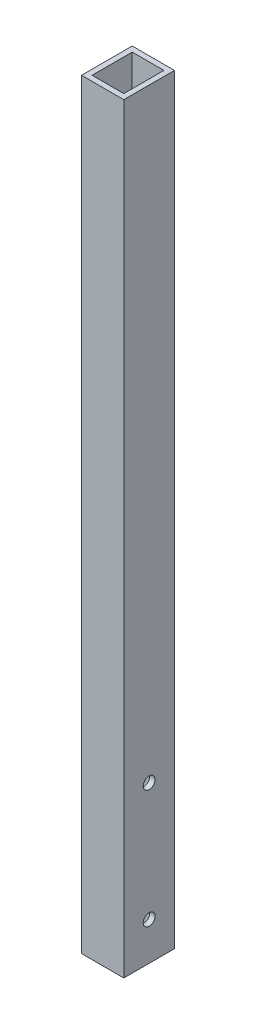
ISO-10303-21;
HEADER;
FILE_DESCRIPTION(('STEP AP214'),'2;1');
FILE_NAME('part.step','',(''),(''),'','','');
FILE_SCHEMA(('AUTOMOTIVE_DESIGN { 1 0 10303 214 1 1 1 1 }'));
ENDSEC;
DATA;
#1=APPLICATION_CONTEXT('core data for automotive mechanical design processes');
#2=APPLICATION_PROTOCOL_DEFINITION('international standard','automotive_design',2000,#1);
#3=PRODUCT_CONTEXT('',#1,'mechanical');
#4=PRODUCT('Part','Part','',(#3));
#5=PRODUCT_RELATED_PRODUCT_CATEGORY('part','',(#4));
#6=PRODUCT_DEFINITION_FORMATION('','',#4);
#7=PRODUCT_DEFINITION_CONTEXT('part definition',#1,'design');
#8=PRODUCT_DEFINITION('design','',#6,#7);
#9=PRODUCT_DEFINITION_SHAPE('','',#8);
#10=(LENGTH_UNIT() NAMED_UNIT(*) SI_UNIT(.MILLI.,.METRE.));
#11=(NAMED_UNIT(*) PLANE_ANGLE_UNIT() SI_UNIT($,.RADIAN.));
#12=(NAMED_UNIT(*) SI_UNIT($,.STERADIAN.) SOLID_ANGLE_UNIT());
#13=UNCERTAINTY_MEASURE_WITH_UNIT(LENGTH_MEASURE(1.E-05),#10,'distance_accuracy_value','');
#14=(GEOMETRIC_REPRESENTATION_CONTEXT(3) GLOBAL_UNCERTAINTY_ASSIGNED_CONTEXT((#13)) GLOBAL_UNIT_ASSIGNED_CONTEXT((#10,
#11,#12)) REPRESENTATION_CONTEXT('',''));
#15=CARTESIAN_POINT('',(0.,0.,0.));
#16=DIRECTION('',(0.,0.,1.));
#17=DIRECTION('',(1.,0.,0.));
#18=AXIS2_PLACEMENT_3D('',#15,#16,#17);
#19=CARTESIAN_POINT('',(-31.75,-1143.,38.1));
#20=DIRECTION('',(-1.,0.,0.));
#21=DIRECTION('',(0.,0.,1.));
#22=AXIS2_PLACEMENT_3D('',#19,#20,#21);
#23=PLANE('',#22);
#24=CARTESIAN_POINT('',(-31.75,-908.05,0.));
#25=DIRECTION('',(-1.,0.,0.));
#26=DIRECTION('',(0.,0.,1.));
#27=AXIS2_PLACEMENT_3D('',#24,#25,#26);
#28=CIRCLE('',#27,8.88999999999998);
#29=CARTESIAN_POINT('',(-31.75,-908.05,8.88999999999999));
#30=VERTEX_POINT('',#29);
#31=EDGE_CURVE('E208',#30,#30,#28,.T.);
#32=ORIENTED_EDGE('',*,*,#31,.F.);
#33=EDGE_LOOP('',(#32));
#34=FACE_BOUND('',#33,.T.);
#35=CARTESIAN_POINT('',(-31.75,-1085.85,0.));
#36=DIRECTION('',(-1.,0.,0.));
#37=DIRECTION('',(0.,0.,1.));
#38=AXIS2_PLACEMENT_3D('',#35,#36,#37);
#39=CIRCLE('',#38,8.88999999999998);
#40=CARTESIAN_POINT('',(-31.75,-1085.85,8.88999999999999));
#41=VERTEX_POINT('',#40);
#42=EDGE_CURVE('E220',#41,#41,#39,.T.);
#43=ORIENTED_EDGE('',*,*,#42,.F.);
#44=EDGE_LOOP('',(#43));
#45=FACE_BOUND('',#44,.T.);
#46=DIRECTION('',(0.,0.,1.));
#47=VECTOR('',#46,1.);
#48=CARTESIAN_POINT('',(-31.75,0.,38.1));
#49=LINE('',#48,#47);
#50=CARTESIAN_POINT('',(-31.75,0.,-38.1));
#51=VERTEX_POINT('',#50);
#52=CARTESIAN_POINT('',(-31.75,0.,38.1));
#53=VERTEX_POINT('',#52);
#54=EDGE_CURVE('E153',#51,#53,#49,.T.);
#55=ORIENTED_EDGE('',*,*,#54,.F.);
#56=DIRECTION('',(0.,1.,0.));
#57=VECTOR('',#56,1.);
#58=CARTESIAN_POINT('',(-31.75,-1143.,-38.1));
#59=LINE('',#58,#57);
#60=CARTESIAN_POINT('',(-31.75,-1143.,-38.1));
#61=VERTEX_POINT('',#60);
#62=EDGE_CURVE('E11',#61,#51,#59,.T.);
#63=ORIENTED_EDGE('',*,*,#62,.F.);
#64=DIRECTION('',(0.,0.,1.));
#65=VECTOR('',#64,1.);
#66=CARTESIAN_POINT('',(-31.75,-1143.,38.1));
#67=LINE('',#66,#65);
#68=CARTESIAN_POINT('',(-31.75,-1143.,38.1));
#69=VERTEX_POINT('',#68);
#70=EDGE_CURVE('E159',#61,#69,#67,.T.);
#71=ORIENTED_EDGE('',*,*,#70,.T.);
#72=DIRECTION('',(0.,1.,0.));
#73=VECTOR('',#72,1.);
#74=CARTESIAN_POINT('',(-31.75,-1143.,38.1));
#75=LINE('',#74,#73);
#76=EDGE_CURVE('E176',#69,#53,#75,.T.);
#77=ORIENTED_EDGE('',*,*,#76,.T.);
#78=EDGE_LOOP('',(#55,#63,#71,#77));
#79=FACE_BOUND('',#78,.T.);
#80=ADVANCED_FACE('F41',(#34,#45,#79),#23,.T.);
#81=CARTESIAN_POINT('',(31.75,-1143.,-38.1));
#82=DIRECTION('',(0.,0.,-1.));
#83=DIRECTION('',(-1.,0.,0.));
#84=AXIS2_PLACEMENT_3D('',#81,#82,#83);
#85=PLANE('',#84);
#86=DIRECTION('',(-1.,0.,0.));
#87=VECTOR('',#86,1.);
#88=CARTESIAN_POINT('',(31.75,0.,-38.1));
#89=LINE('',#88,#87);
#90=CARTESIAN_POINT('',(31.75,0.,-38.1));
#91=VERTEX_POINT('',#90);
#92=EDGE_CURVE('E164',#91,#51,#89,.T.);
#93=ORIENTED_EDGE('',*,*,#92,.F.);
#94=DIRECTION('',(0.,1.,0.));
#95=VECTOR('',#94,1.);
#96=CARTESIAN_POINT('',(31.75,-1143.,-38.1));
#97=LINE('',#96,#95);
#98=CARTESIAN_POINT('',(31.75,-1143.,-38.1));
#99=VERTEX_POINT('',#98);
#100=EDGE_CURVE('E50',#99,#91,#97,.T.);
#101=ORIENTED_EDGE('',*,*,#100,.F.);
#102=DIRECTION('',(-1.,0.,0.));
#103=VECTOR('',#102,1.);
#104=CARTESIAN_POINT('',(31.75,-1143.,-38.1));
#105=LINE('',#104,#103);
#106=EDGE_CURVE('E172',#99,#61,#105,.T.);
#107=ORIENTED_EDGE('',*,*,#106,.T.);
#108=ORIENTED_EDGE('',*,*,#62,.T.);
#109=EDGE_LOOP('',(#93,#101,#107,#108));
#110=FACE_BOUND('',#109,.T.);
#111=ADVANCED_FACE('F230',(#110),#85,.T.);
#112=CARTESIAN_POINT('',(31.75,-1143.,38.1));
#113=DIRECTION('',(1.,0.,0.));
#114=DIRECTION('',(0.,0.,-1.));
#115=AXIS2_PLACEMENT_3D('',#112,#113,#114);
#116=PLANE('',#115);
#117=CARTESIAN_POINT('',(31.75,-908.05,0.));
#118=DIRECTION('',(-1.,0.,0.));
#119=DIRECTION('',(0.,0.,1.));
#120=AXIS2_PLACEMENT_3D('',#117,#118,#119);
#121=CIRCLE('',#120,8.88999999999998);
#122=CARTESIAN_POINT('',(31.75,-908.05,8.88999999999999));
#123=VERTEX_POINT('',#122);
#124=EDGE_CURVE('E201',#123,#123,#121,.T.);
#125=ORIENTED_EDGE('',*,*,#124,.T.);
#126=EDGE_LOOP('',(#125));
#127=FACE_BOUND('',#126,.T.);
#128=CARTESIAN_POINT('',(31.75,-1085.85,0.));
#129=DIRECTION('',(-1.,0.,0.));
#130=DIRECTION('',(0.,0.,1.));
#131=AXIS2_PLACEMENT_3D('',#128,#129,#130);
#132=CIRCLE('',#131,8.88999999999998);
#133=CARTESIAN_POINT('',(31.75,-1085.85,8.88999999999999));
#134=VERTEX_POINT('',#133);
#135=EDGE_CURVE('E214',#134,#134,#132,.T.);
#136=ORIENTED_EDGE('',*,*,#135,.T.);
#137=EDGE_LOOP('',(#136));
#138=FACE_BOUND('',#137,.T.);
#139=DIRECTION('',(0.,0.,-1.));
#140=VECTOR('',#139,1.);
#141=CARTESIAN_POINT('',(31.75,0.,38.1));
#142=LINE('',#141,#140);
#143=CARTESIAN_POINT('',(31.75,0.,38.1));
#144=VERTEX_POINT('',#143);
#145=EDGE_CURVE('E184',#144,#91,#142,.T.);
#146=ORIENTED_EDGE('',*,*,#145,.F.);
#147=DIRECTION('',(0.,1.,0.));
#148=VECTOR('',#147,1.);
#149=CARTESIAN_POINT('',(31.75,-1143.,38.1));
#150=LINE('',#149,#148);
#151=CARTESIAN_POINT('',(31.75,-1143.,38.1));
#152=VERTEX_POINT('',#151);
#153=EDGE_CURVE('E193',#152,#144,#150,.T.);
#154=ORIENTED_EDGE('',*,*,#153,.F.);
#155=DIRECTION('',(0.,0.,-1.));
#156=VECTOR('',#155,1.);
#157=CARTESIAN_POINT('',(31.75,-1143.,38.1));
#158=LINE('',#157,#156);
#159=EDGE_CURVE('E168',#152,#99,#158,.T.);
#160=ORIENTED_EDGE('',*,*,#159,.T.);
#161=ORIENTED_EDGE('',*,*,#100,.T.);
#162=EDGE_LOOP('',(#146,#154,#160,#161));
#163=FACE_BOUND('',#162,.T.);
#164=ADVANCED_FACE('F246',(#127,#138,#163),#116,.T.);
#165=CARTESIAN_POINT('',(31.75,-1143.,38.1));
#166=DIRECTION('',(0.,0.,1.));
#167=DIRECTION('',(1.,0.,0.));
#168=AXIS2_PLACEMENT_3D('',#165,#166,#167);
#169=PLANE('',#168);
#170=DIRECTION('',(1.,0.,0.));
#171=VECTOR('',#170,1.);
#172=CARTESIAN_POINT('',(31.75,0.,38.1));
#173=LINE('',#172,#171);
#174=EDGE_CURVE('E180',#53,#144,#173,.T.);
#175=ORIENTED_EDGE('',*,*,#174,.F.);
#176=ORIENTED_EDGE('',*,*,#76,.F.);
#177=DIRECTION('',(1.,0.,0.));
#178=VECTOR('',#177,1.);
#179=CARTESIAN_POINT('',(31.75,-1143.,38.1));
#180=LINE('',#179,#178);
#181=EDGE_CURVE('E163',#69,#152,#180,.T.);
#182=ORIENTED_EDGE('',*,*,#181,.T.);
#183=ORIENTED_EDGE('',*,*,#153,.T.);
#184=EDGE_LOOP('',(#175,#176,#182,#183));
#185=FACE_BOUND('',#184,.T.);
#186=ADVANCED_FACE('F244',(#185),#169,.T.);
#187=CARTESIAN_POINT('',(0.,-1143.,0.));
#188=DIRECTION('',(0.,1.,0.));
#189=DIRECTION('',(0.,0.,1.));
#190=AXIS2_PLACEMENT_3D('',#187,#188,#189);
#191=PLANE('',#190);
#192=DIRECTION('',(-1.,0.,0.));
#193=VECTOR('',#192,1.);
#194=CARTESIAN_POINT('',(-23.8125,-1143.,30.1625));
#195=LINE('',#194,#193);
#196=CARTESIAN_POINT('',(23.8125,-1143.,30.1625));
#197=VERTEX_POINT('',#196);
#198=CARTESIAN_POINT('',(-23.8125,-1143.,30.1625));
#199=VERTEX_POINT('',#198);
#200=EDGE_CURVE('E144',#197,#199,#195,.T.);
#201=ORIENTED_EDGE('',*,*,#200,.F.);
#202=DIRECTION('',(0.,0.,1.));
#203=VECTOR('',#202,1.);
#204=CARTESIAN_POINT('',(23.8125,-1143.,30.1625));
#205=LINE('',#204,#203);
#206=CARTESIAN_POINT('',(23.8125,-1143.,-30.1625));
#207=VERTEX_POINT('',#206);
#208=EDGE_CURVE('E58',#207,#197,#205,.T.);
#209=ORIENTED_EDGE('',*,*,#208,.F.);
#210=DIRECTION('',(1.,0.,0.));
#211=VECTOR('',#210,1.);
#212=CARTESIAN_POINT('',(-23.8125,-1143.,-30.1625));
#213=LINE('',#212,#211);
#214=CARTESIAN_POINT('',(-23.8125,-1143.,-30.1625));
#215=VERTEX_POINT('',#214);
#216=EDGE_CURVE('E128',#215,#207,#213,.T.);
#217=ORIENTED_EDGE('',*,*,#216,.F.);
#218=DIRECTION('',(0.,0.,-1.));
#219=VECTOR('',#218,1.);
#220=CARTESIAN_POINT('',(-23.8125,-1143.,30.1625));
#221=LINE('',#220,#219);
#222=EDGE_CURVE('E132',#199,#215,#221,.T.);
#223=ORIENTED_EDGE('',*,*,#222,.F.);
#224=EDGE_LOOP('',(#201,#209,#217,#223));
#225=FACE_BOUND('',#224,.T.);
#226=ORIENTED_EDGE('',*,*,#70,.F.);
#227=ORIENTED_EDGE('',*,*,#106,.F.);
#228=ORIENTED_EDGE('',*,*,#159,.F.);
#229=ORIENTED_EDGE('',*,*,#181,.F.);
#230=EDGE_LOOP('',(#226,#227,#228,#229));
#231=FACE_BOUND('',#230,.T.);
#232=ADVANCED_FACE('F241',(#225,#231),#191,.F.);
#233=CARTESIAN_POINT('',(0.,0.,0.));
#234=DIRECTION('',(0.,1.,0.));
#235=DIRECTION('',(0.,0.,1.));
#236=AXIS2_PLACEMENT_3D('',#233,#234,#235);
#237=PLANE('',#236);
#238=DIRECTION('',(0.,0.,1.));
#239=VECTOR('',#238,1.);
#240=CARTESIAN_POINT('',(23.8125,0.,30.1625));
#241=LINE('',#240,#239);
#242=CARTESIAN_POINT('',(23.8125,0.,-30.1625));
#243=VERTEX_POINT('',#242);
#244=CARTESIAN_POINT('',(23.8125,0.,30.1625));
#245=VERTEX_POINT('',#244);
#246=EDGE_CURVE('E109',#243,#245,#241,.T.);
#247=ORIENTED_EDGE('',*,*,#246,.T.);
#248=DIRECTION('',(-1.,0.,0.));
#249=VECTOR('',#248,1.);
#250=CARTESIAN_POINT('',(-23.8125,0.,30.1625));
#251=LINE('',#250,#249);
#252=CARTESIAN_POINT('',(-23.8125,0.,30.1625));
#253=VERTEX_POINT('',#252);
#254=EDGE_CURVE('E119',#245,#253,#251,.T.);
#255=ORIENTED_EDGE('',*,*,#254,.T.);
#256=DIRECTION('',(0.,0.,-1.));
#257=VECTOR('',#256,1.);
#258=CARTESIAN_POINT('',(-23.8125,0.,30.1625));
#259=LINE('',#258,#257);
#260=CARTESIAN_POINT('',(-23.8125,0.,-30.1625));
#261=VERTEX_POINT('',#260);
#262=EDGE_CURVE('E66',#253,#261,#259,.T.);
#263=ORIENTED_EDGE('',*,*,#262,.T.);
#264=DIRECTION('',(1.,0.,0.));
#265=VECTOR('',#264,1.);
#266=CARTESIAN_POINT('',(-23.8125,0.,-30.1625));
#267=LINE('',#266,#265);
#268=EDGE_CURVE('E116',#261,#243,#267,.T.);
#269=ORIENTED_EDGE('',*,*,#268,.T.);
#270=EDGE_LOOP('',(#247,#255,#263,#269));
#271=FACE_BOUND('',#270,.T.);
#272=ORIENTED_EDGE('',*,*,#54,.T.);
#273=ORIENTED_EDGE('',*,*,#174,.T.);
#274=ORIENTED_EDGE('',*,*,#145,.T.);
#275=ORIENTED_EDGE('',*,*,#92,.T.);
#276=EDGE_LOOP('',(#272,#273,#274,#275));
#277=FACE_BOUND('',#276,.T.);
#278=ADVANCED_FACE('F124',(#271,#277),#237,.T.);
#279=CARTESIAN_POINT('',(23.8125,0.,30.1625));
#280=DIRECTION('',(1.,0.,0.));
#281=DIRECTION('',(0.,0.,-1.));
#282=AXIS2_PLACEMENT_3D('',#279,#280,#281);
#283=PLANE('',#282);
#284=CARTESIAN_POINT('',(23.8125,-908.05,0.));
#285=DIRECTION('',(1.,0.,0.));
#286=DIRECTION('',(0.,0.,-1.));
#287=AXIS2_PLACEMENT_3D('',#284,#285,#286);
#288=CIRCLE('',#287,8.88999999999998);
#289=CARTESIAN_POINT('',(23.8125,-908.05,-8.88999999999998));
#290=VERTEX_POINT('',#289);
#291=EDGE_CURVE('E135',#290,#290,#288,.T.);
#292=ORIENTED_EDGE('',*,*,#291,.T.);
#293=EDGE_LOOP('',(#292));
#294=FACE_BOUND('',#293,.T.);
#295=CARTESIAN_POINT('',(23.8125,-1085.85,0.));
#296=DIRECTION('',(1.,0.,0.));
#297=DIRECTION('',(0.,0.,-1.));
#298=AXIS2_PLACEMENT_3D('',#295,#296,#297);
#299=CIRCLE('',#298,8.88999999999998);
#300=CARTESIAN_POINT('',(23.8125,-1085.85,-8.88999999999998));
#301=VERTEX_POINT('',#300);
#302=EDGE_CURVE('E200',#301,#301,#299,.T.);
#303=ORIENTED_EDGE('',*,*,#302,.T.);
#304=EDGE_LOOP('',(#303));
#305=FACE_BOUND('',#304,.T.);
#306=ORIENTED_EDGE('',*,*,#208,.T.);
#307=DIRECTION('',(0.,-1.,0.));
#308=VECTOR('',#307,1.);
#309=CARTESIAN_POINT('',(23.8125,0.,30.1625));
#310=LINE('',#309,#308);
#311=EDGE_CURVE('E105',#245,#197,#310,.T.);
#312=ORIENTED_EDGE('',*,*,#311,.F.);
#313=ORIENTED_EDGE('',*,*,#246,.F.);
#314=DIRECTION('',(0.,-1.,0.));
#315=VECTOR('',#314,1.);
#316=CARTESIAN_POINT('',(23.8125,0.,-30.1625));
#317=LINE('',#316,#315);
#318=EDGE_CURVE('E150',#243,#207,#317,.T.);
#319=ORIENTED_EDGE('',*,*,#318,.T.);
#320=EDGE_LOOP('',(#306,#312,#313,#319));
#321=FACE_BOUND('',#320,.T.);
#322=ADVANCED_FACE('F107',(#294,#305,#321),#283,.F.);
#323=CARTESIAN_POINT('',(-23.8125,0.,-30.1625));
#324=DIRECTION('',(0.,0.,-1.));
#325=DIRECTION('',(-1.,0.,0.));
#326=AXIS2_PLACEMENT_3D('',#323,#324,#325);
#327=PLANE('',#326);
#328=ORIENTED_EDGE('',*,*,#216,.T.);
#329=ORIENTED_EDGE('',*,*,#318,.F.);
#330=ORIENTED_EDGE('',*,*,#268,.F.);
#331=DIRECTION('',(0.,-1.,0.));
#332=VECTOR('',#331,1.);
#333=CARTESIAN_POINT('',(-23.8125,0.,-30.1625));
#334=LINE('',#333,#332);
#335=EDGE_CURVE('E154',#261,#215,#334,.T.);
#336=ORIENTED_EDGE('',*,*,#335,.T.);
#337=EDGE_LOOP('',(#328,#329,#330,#336));
#338=FACE_BOUND('',#337,.T.);
#339=ADVANCED_FACE('F263',(#338),#327,.F.);
#340=CARTESIAN_POINT('',(-23.8125,0.,30.1625));
#341=DIRECTION('',(-1.,0.,0.));
#342=DIRECTION('',(0.,0.,1.));
#343=AXIS2_PLACEMENT_3D('',#340,#341,#342);
#344=PLANE('',#343);
#345=CARTESIAN_POINT('',(-23.8125,-908.05,0.));
#346=DIRECTION('',(-1.,0.,0.));
#347=DIRECTION('',(0.,0.,1.));
#348=AXIS2_PLACEMENT_3D('',#345,#346,#347);
#349=CIRCLE('',#348,8.88999999999998);
#350=CARTESIAN_POINT('',(-23.8125,-908.05,8.88999999999999));
#351=VERTEX_POINT('',#350);
#352=EDGE_CURVE('E44',#351,#351,#349,.T.);
#353=ORIENTED_EDGE('',*,*,#352,.T.);
#354=EDGE_LOOP('',(#353));
#355=FACE_BOUND('',#354,.T.);
#356=CARTESIAN_POINT('',(-23.8125,-1085.85,0.));
#357=DIRECTION('',(-1.,0.,0.));
#358=DIRECTION('',(0.,0.,1.));
#359=AXIS2_PLACEMENT_3D('',#356,#357,#358);
#360=CIRCLE('',#359,8.88999999999998);
#361=CARTESIAN_POINT('',(-23.8125,-1085.85,8.88999999999999));
#362=VERTEX_POINT('',#361);
#363=EDGE_CURVE('E197',#362,#362,#360,.T.);
#364=ORIENTED_EDGE('',*,*,#363,.T.);
#365=EDGE_LOOP('',(#364));
#366=FACE_BOUND('',#365,.T.);
#367=ORIENTED_EDGE('',*,*,#222,.T.);
#368=ORIENTED_EDGE('',*,*,#335,.F.);
#369=ORIENTED_EDGE('',*,*,#262,.F.);
#370=DIRECTION('',(0.,-1.,0.));
#371=VECTOR('',#370,1.);
#372=CARTESIAN_POINT('',(-23.8125,0.,30.1625));
#373=LINE('',#372,#371);
#374=EDGE_CURVE('E115',#253,#199,#373,.T.);
#375=ORIENTED_EDGE('',*,*,#374,.T.);
#376=EDGE_LOOP('',(#367,#368,#369,#375));
#377=FACE_BOUND('',#376,.T.);
#378=ADVANCED_FACE('F267',(#355,#366,#377),#344,.F.);
#379=CARTESIAN_POINT('',(-23.8125,0.,30.1625));
#380=DIRECTION('',(0.,0.,1.));
#381=DIRECTION('',(1.,0.,0.));
#382=AXIS2_PLACEMENT_3D('',#379,#380,#381);
#383=PLANE('',#382);
#384=ORIENTED_EDGE('',*,*,#200,.T.);
#385=ORIENTED_EDGE('',*,*,#374,.F.);
#386=ORIENTED_EDGE('',*,*,#254,.F.);
#387=ORIENTED_EDGE('',*,*,#311,.T.);
#388=EDGE_LOOP('',(#384,#385,#386,#387));
#389=FACE_BOUND('',#388,.T.);
#390=ADVANCED_FACE('F120',(#389),#383,.F.);
#391=CARTESIAN_POINT('',(31.75,-1085.85,0.));
#392=DIRECTION('',(-1.,0.,0.));
#393=DIRECTION('',(0.,0.,1.));
#394=AXIS2_PLACEMENT_3D('',#391,#392,#393);
#395=CYLINDRICAL_SURFACE('',#394,8.88999999999998);
#396=ORIENTED_EDGE('',*,*,#42,.T.);
#397=EDGE_LOOP('',(#396));
#398=FACE_BOUND('',#397,.T.);
#399=ORIENTED_EDGE('',*,*,#363,.F.);
#400=EDGE_LOOP('',(#399));
#401=FACE_BOUND('',#400,.T.);
#402=ADVANCED_FACE('F225',(#398,#401),#395,.F.);
#403=CARTESIAN_POINT('',(31.75,-908.05,0.));
#404=DIRECTION('',(-1.,0.,0.));
#405=DIRECTION('',(0.,0.,1.));
#406=AXIS2_PLACEMENT_3D('',#403,#404,#405);
#407=CYLINDRICAL_SURFACE('',#406,8.88999999999998);
#408=ORIENTED_EDGE('',*,*,#31,.T.);
#409=EDGE_LOOP('',(#408));
#410=FACE_BOUND('',#409,.T.);
#411=ORIENTED_EDGE('',*,*,#352,.F.);
#412=EDGE_LOOP('',(#411));
#413=FACE_BOUND('',#412,.T.);
#414=ADVANCED_FACE('F278',(#410,#413),#407,.F.);
#415=ORIENTED_EDGE('',*,*,#135,.F.);
#416=EDGE_LOOP('',(#415));
#417=FACE_BOUND('',#416,.T.);
#418=ORIENTED_EDGE('',*,*,#302,.F.);
#419=EDGE_LOOP('',(#418));
#420=FACE_BOUND('',#419,.T.);
#421=ADVANCED_FACE('F274',(#417,#420),#395,.F.);
#422=ORIENTED_EDGE('',*,*,#124,.F.);
#423=EDGE_LOOP('',(#422));
#424=FACE_BOUND('',#423,.T.);
#425=ORIENTED_EDGE('',*,*,#291,.F.);
#426=EDGE_LOOP('',(#425));
#427=FACE_BOUND('',#426,.T.);
#428=ADVANCED_FACE('F277',(#424,#427),#407,.F.);
#429=CLOSED_SHELL('',(#80,#111,#164,#186,#232,#278,#322,#339,#378,#390,#402,#414,#421,#428));
#430=MANIFOLD_SOLID_BREP('B2',#429);
#431=ADVANCED_BREP_SHAPE_REPRESENTATION('',(#18,#430),#14);
#432=SHAPE_DEFINITION_REPRESENTATION(#9,#431);
ENDSEC;
END-ISO-10303-21;
